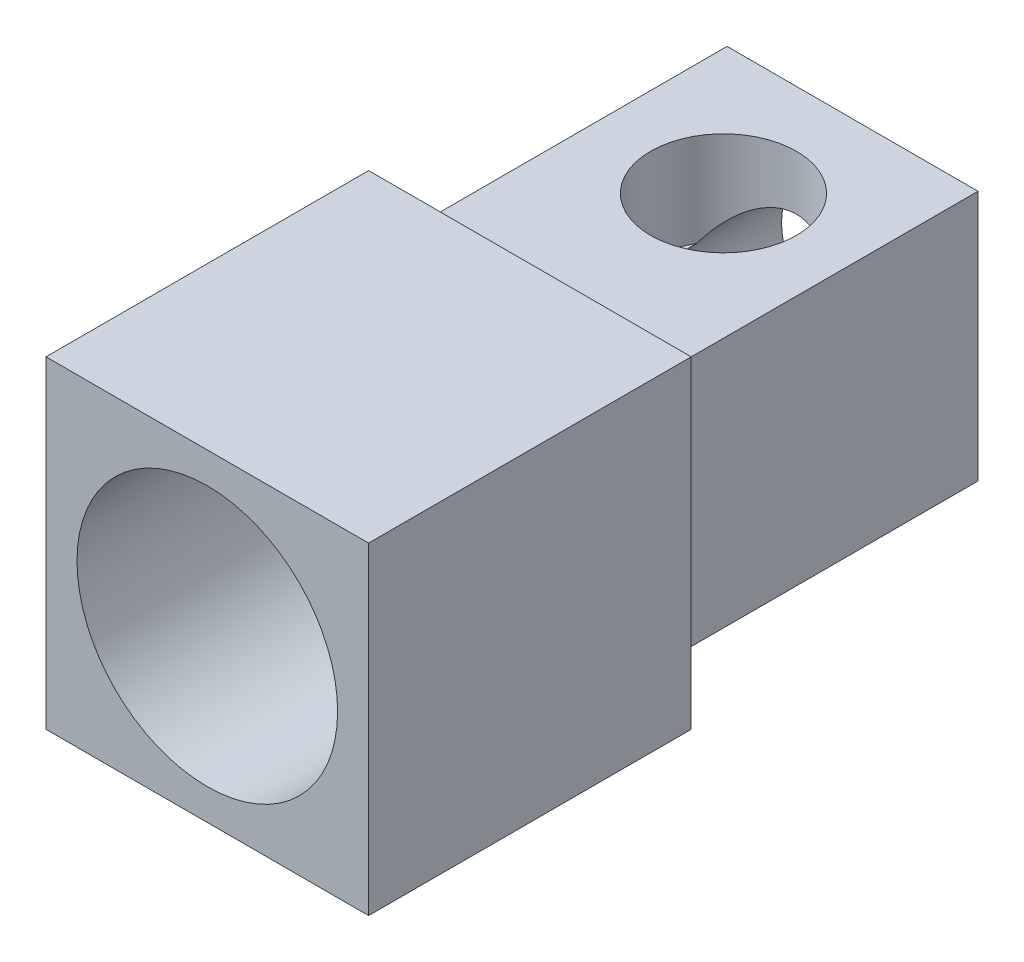
ISO-10303-21;
HEADER;
FILE_DESCRIPTION(('STEP AP214'),'2;1');
FILE_NAME('part.step','',(''),(''),'','','');
FILE_SCHEMA(('AUTOMOTIVE_DESIGN { 1 0 10303 214 1 1 1 1 }'));
ENDSEC;
DATA;
#1=APPLICATION_CONTEXT('core data for automotive mechanical design processes');
#2=APPLICATION_PROTOCOL_DEFINITION('international standard','automotive_design',2000,#1);
#3=PRODUCT_CONTEXT('',#1,'mechanical');
#4=PRODUCT('Part','Part','',(#3));
#5=PRODUCT_RELATED_PRODUCT_CATEGORY('part','',(#4));
#6=PRODUCT_DEFINITION_FORMATION('','',#4);
#7=PRODUCT_DEFINITION_CONTEXT('part definition',#1,'design');
#8=PRODUCT_DEFINITION('design','',#6,#7);
#9=PRODUCT_DEFINITION_SHAPE('','',#8);
#10=(LENGTH_UNIT() NAMED_UNIT(*) SI_UNIT(.MILLI.,.METRE.));
#11=(NAMED_UNIT(*) PLANE_ANGLE_UNIT() SI_UNIT($,.RADIAN.));
#12=(NAMED_UNIT(*) SI_UNIT($,.STERADIAN.) SOLID_ANGLE_UNIT());
#13=UNCERTAINTY_MEASURE_WITH_UNIT(LENGTH_MEASURE(1.E-05),#10,'distance_accuracy_value','');
#14=(GEOMETRIC_REPRESENTATION_CONTEXT(3) GLOBAL_UNCERTAINTY_ASSIGNED_CONTEXT((#13)) GLOBAL_UNIT_ASSIGNED_CONTEXT((#10,
#11,#12)) REPRESENTATION_CONTEXT('',''));
#15=CARTESIAN_POINT('',(0.,0.,0.));
#16=DIRECTION('',(0.,0.,1.));
#17=DIRECTION('',(1.,0.,0.));
#18=AXIS2_PLACEMENT_3D('',#15,#16,#17);
#19=CARTESIAN_POINT('',(0.,0.,0.));
#20=DIRECTION('',(0.,0.,1.));
#21=DIRECTION('',(1.,0.,0.));
#22=AXIS2_PLACEMENT_3D('',#19,#20,#21);
#23=PLANE('',#22);
#24=CARTESIAN_POINT('',(-3.41304347826087,-0.260869565217391,0.));
#25=DIRECTION('',(0.,0.,-1.));
#26=DIRECTION('',(-1.,0.,0.));
#27=AXIS2_PLACEMENT_3D('',#24,#25,#26);
#28=CIRCLE('',#27,1.1);
#29=CARTESIAN_POINT('',(-4.51304347826087,-0.260869565217391,0.));
#30=VERTEX_POINT('',#29);
#31=EDGE_CURVE('E240',#30,#30,#28,.T.);
#32=ORIENTED_EDGE('',*,*,#31,.F.);
#33=EDGE_LOOP('',(#32));
#34=FACE_BOUND('',#33,.T.);
#35=DIRECTION('',(0.,-1.,0.));
#36=VECTOR('',#35,1.);
#37=CARTESIAN_POINT('',(-1.46849982999786,-2.20541321348039,0.));
#38=LINE('',#37,#36);
#39=CARTESIAN_POINT('',(-1.46849982999786,1.68367408304561,0.));
#40=VERTEX_POINT('',#39);
#41=CARTESIAN_POINT('',(-1.46849982999786,-2.20541321348039,0.));
#42=VERTEX_POINT('',#41);
#43=EDGE_CURVE('E141',#40,#42,#38,.T.);
#44=ORIENTED_EDGE('',*,*,#43,.T.);
#45=DIRECTION('',(-1.,0.,0.));
#46=VECTOR('',#45,1.);
#47=CARTESIAN_POINT('',(-1.46849982999786,-2.20541321348039,0.));
#48=LINE('',#47,#46);
#49=CARTESIAN_POINT('',(-5.35758712652388,-2.20541321348039,0.));
#50=VERTEX_POINT('',#49);
#51=EDGE_CURVE('E115',#42,#50,#48,.T.);
#52=ORIENTED_EDGE('',*,*,#51,.T.);
#53=DIRECTION('',(0.,1.,0.));
#54=VECTOR('',#53,1.);
#55=CARTESIAN_POINT('',(-5.35758712652388,-2.20541321348039,0.));
#56=LINE('',#55,#54);
#57=CARTESIAN_POINT('',(-5.35758712652388,1.68367408304561,0.));
#58=VERTEX_POINT('',#57);
#59=EDGE_CURVE('E55',#50,#58,#56,.T.);
#60=ORIENTED_EDGE('',*,*,#59,.T.);
#61=DIRECTION('',(1.,0.,0.));
#62=VECTOR('',#61,1.);
#63=CARTESIAN_POINT('',(-1.46849982999786,1.68367408304561,0.));
#64=LINE('',#63,#62);
#65=EDGE_CURVE('E134',#58,#40,#64,.T.);
#66=ORIENTED_EDGE('',*,*,#65,.T.);
#67=EDGE_LOOP('',(#44,#52,#60,#66));
#68=FACE_BOUND('',#67,.T.);
#69=ADVANCED_FACE('F33',(#34,#68),#23,.F.);
#70=CARTESIAN_POINT('',(-3.41304347826087,0.239130434782609,2.));
#71=DIRECTION('',(0.,1.,0.));
#72=DIRECTION('',(-1.,0.,0.));
#73=AXIS2_PLACEMENT_3D('',#70,#71,#72);
#74=CYLINDRICAL_SURFACE('',#73,1.1303);
#75=CARTESIAN_POINT('',(-3.41304347826087,0.239130434782609,2.));
#76=DIRECTION('',(0.,1.,0.));
#77=DIRECTION('',(-1.,0.,0.));
#78=AXIS2_PLACEMENT_3D('',#75,#76,#77);
#79=CIRCLE('',#78,1.1303);
#80=CARTESIAN_POINT('',(-2.4332475811476,0.239130434782609,2.56354067288884));
#81=VERTEX_POINT('',#80);
#82=CARTESIAN_POINT('',(-2.4332475811476,0.239130434782609,1.43645932711116));
#83=VERTEX_POINT('',#82);
#84=EDGE_CURVE('E159',#81,#83,#79,.T.);
#85=ORIENTED_EDGE('',*,*,#84,.F.);
#86=CARTESIAN_POINT('',(-4.39283937537414,0.239130434782609,2.56354067288883));
#87=CARTESIAN_POINT('',(-4.37629129599731,0.271519858096063,2.59231836773183));
#88=CARTESIAN_POINT('',(-4.35811320989576,0.303207503549897,2.62098294087009));
#89=CARTESIAN_POINT('',(-4.31831036586881,0.365118265753084,2.67769590911217));
#90=CARTESIAN_POINT('',(-4.29667623328289,0.395337098862779,2.70574238513539));
#91=CARTESIAN_POINT('',(-4.24958140363458,0.454424023581486,2.76099733355327));
#92=CARTESIAN_POINT('',(-4.2240775884234,0.483271356855061,2.78819156708674));
#93=CARTESIAN_POINT('',(-4.16933927121493,0.538840857616629,2.84085396298437));
#94=CARTESIAN_POINT('',(-4.14010949331117,0.56556564778696,2.86632424957176));
#95=CARTESIAN_POINT('',(-4.07041150362564,0.622500042646617,2.92078010205513));
#96=CARTESIAN_POINT('',(-4.02891933040392,0.652042433014698,2.94917559370353));
#97=CARTESIAN_POINT('',(-3.94020751224405,0.705968397418197,3.0011506046098));
#98=CARTESIAN_POINT('',(-3.89301350307135,0.73037380185854,3.02475048809601));
#99=CARTESIAN_POINT('',(-3.80132306818623,0.76932682588183,3.06247979976721));
#100=CARTESIAN_POINT('',(-3.75761299571348,0.784828510742617,3.0775218402842));
#101=CARTESIAN_POINT('',(-3.66716599047387,0.810403746001871,3.10235893960548));
#102=CARTESIAN_POINT('',(-3.62042905536271,0.820477292196188,3.11215399434593));
#103=CARTESIAN_POINT('',(-3.5249289770623,0.834493483598695,3.1257866607039));
#104=CARTESIAN_POINT('',(-3.47615691062973,0.838405379738677,3.12959439305675));
#105=CARTESIAN_POINT('',(-3.37845468556489,0.839670560650714,3.13082563557435));
#106=CARTESIAN_POINT('',(-3.32952457659995,0.837025737197622,3.12825098721289));
#107=CARTESIAN_POINT('',(-3.23734962397292,0.825914870606985,3.11744219980031));
#108=CARTESIAN_POINT('',(-3.19397878847868,0.817971419566254,3.10971615850827));
#109=CARTESIAN_POINT('',(-3.10951802059535,0.797319992440406,3.08965009096581));
#110=CARTESIAN_POINT('',(-3.06842875716512,0.784610627365649,3.07730871961518));
#111=CARTESIAN_POINT('',(-2.9768586431031,0.750474264713503,3.0442086695302));
#112=CARTESIAN_POINT('',(-2.92744617062569,0.727564606370088,3.02202520408776));
#113=CARTESIAN_POINT('',(-2.83446272105367,0.676189731020639,2.97242646387556));
#114=CARTESIAN_POINT('',(-2.79090420645091,0.64771296873239,2.94500031929871));
#115=CARTESIAN_POINT('',(-2.69537956071242,0.57561383266525,2.87586688294728));
#116=CARTESIAN_POINT('',(-2.64593689888158,0.530207778772215,2.83255048938973));
#117=CARTESIAN_POINT('',(-2.5576969566589,0.433867999141433,2.74160270979468));
#118=CARTESIAN_POINT('',(-2.51890315650036,0.382932473847678,2.69396991983264));
#119=CARTESIAN_POINT('',(-2.4756872739934,0.315037750231637,2.631833598722));
#120=CARTESIAN_POINT('',(-2.46665572358188,0.300070850149582,2.61821512803579));
#121=CARTESIAN_POINT('',(-2.44937724473266,0.269837291073555,2.59091932593116));
#122=CARTESIAN_POINT('',(-2.44112807944188,0.254571647050481,2.57724228682185));
#123=CARTESIAN_POINT('',(-2.43324758114718,0.239130434782859,2.56354067288886));
#124=B_SPLINE_CURVE_WITH_KNOTS('',3,(#86,#87,#88,#89,#90,#91,#92,#93,#94,#95,#96,#97,#98,#99,
#100,#101,#102,#103,#104,#105,#106,#107,#108,#109,#110,#111,#112,#113,#114,#115,#116,#117,#118,
#119,#120,#121,#122,#123),.UNSPECIFIED.,.F.,.F.,(4,2,2,2,2,2,2,2,2,2,2,2,2,2,2,2,2,2,4),(0.,
0.139136476056646,0.27865698207966,0.419865017666792,0.560895766002821,0.735227786573159,
0.908803291850601,1.05446999570251,1.20013681237464,1.34652828660974,1.49287752822034,
1.62658463797202,1.76033074597472,1.93579543150089,2.11162793852052,2.3500268537622,
2.58850358940566,2.65497303724273,2.7212463261039),.UNSPECIFIED.);
#125=CARTESIAN_POINT('',(-4.39283937537414,0.239130434782609,2.56354067288883));
#126=VERTEX_POINT('',#125);
#127=EDGE_CURVE('E160',#126,#81,#124,.T.);
#128=ORIENTED_EDGE('',*,*,#127,.F.);
#129=CARTESIAN_POINT('',(-4.39283937537414,0.239130434782609,1.43645932711117));
#130=VERTEX_POINT('',#129);
#131=EDGE_CURVE('E157',#130,#126,#79,.T.);
#132=ORIENTED_EDGE('',*,*,#131,.F.);
#133=CARTESIAN_POINT('',(-2.4332475811476,0.239130434782609,1.43645932711116));
#134=CARTESIAN_POINT('',(-2.44979566052442,0.271519858096063,1.40768163226817));
#135=CARTESIAN_POINT('',(-2.46797374662598,0.303207503549897,1.37901705912991));
#136=CARTESIAN_POINT('',(-2.50777659065292,0.365118265753084,1.32230409088782));
#137=CARTESIAN_POINT('',(-2.52941072323885,0.395337098862779,1.29425761486461));
#138=CARTESIAN_POINT('',(-2.57650555288716,0.454424023581486,1.23900266644673));
#139=CARTESIAN_POINT('',(-2.60200936809834,0.483271356855062,1.21180843291326));
#140=CARTESIAN_POINT('',(-2.65674768530681,0.53884085761663,1.15914603701562));
#141=CARTESIAN_POINT('',(-2.68597746321057,0.56556564778696,1.13367575042823));
#142=CARTESIAN_POINT('',(-2.7556754528961,0.622500042646618,1.07921989794487));
#143=CARTESIAN_POINT('',(-2.79716762611782,0.652042433014699,1.05082440629647));
#144=CARTESIAN_POINT('',(-2.88587944427769,0.705968397418198,0.9988493953902));
#145=CARTESIAN_POINT('',(-2.93307345345039,0.73037380185854,0.975249511903983));
#146=CARTESIAN_POINT('',(-3.02476388833551,0.769326825881831,0.937520200232784));
#147=CARTESIAN_POINT('',(-3.06847396080826,0.784828510742618,0.922478159715799));
#148=CARTESIAN_POINT('',(-3.15892096604786,0.810403746001871,0.897641060394519));
#149=CARTESIAN_POINT('',(-3.20565790115903,0.820477292196188,0.88784600565407));
#150=CARTESIAN_POINT('',(-3.30115797945944,0.834493483598694,0.874213339296104));
#151=CARTESIAN_POINT('',(-3.34993004589201,0.838405379738677,0.870405606943247));
#152=CARTESIAN_POINT('',(-3.44763227095685,0.839670560650714,0.869174364425654));
#153=CARTESIAN_POINT('',(-3.49656237992179,0.837025737197621,0.871749012787106));
#154=CARTESIAN_POINT('',(-3.58873733254882,0.825914870606984,0.882557800199691));
#155=CARTESIAN_POINT('',(-3.63210816804306,0.817971419566253,0.890283841491731));
#156=CARTESIAN_POINT('',(-3.71656893592639,0.797319992440405,0.910349909034186));
#157=CARTESIAN_POINT('',(-3.75765819935662,0.784610627365649,0.922691280384824));
#158=CARTESIAN_POINT('',(-3.84922831341864,0.750474264713502,0.955791330469802));
#159=CARTESIAN_POINT('',(-3.89864078589605,0.727564606370087,0.977974795912237));
#160=CARTESIAN_POINT('',(-3.99162423546807,0.676189731020639,1.02757353612444));
#161=CARTESIAN_POINT('',(-4.03518275007083,0.64771296873239,1.05499968070129));
#162=CARTESIAN_POINT('',(-4.13070739580932,0.57561383266525,1.12413311705272));
#163=CARTESIAN_POINT('',(-4.18015005764016,0.530207778772215,1.16744951061027));
#164=CARTESIAN_POINT('',(-4.26838999986284,0.433867999141432,1.25839729020532));
#165=CARTESIAN_POINT('',(-4.30718380002138,0.382932473847677,1.30603008016737));
#166=CARTESIAN_POINT('',(-4.35039968252834,0.315037750231637,1.368166401278));
#167=CARTESIAN_POINT('',(-4.35943123293986,0.300070850149581,1.38178487196421));
#168=CARTESIAN_POINT('',(-4.37670971178908,0.269837291073554,1.40908067406884));
#169=CARTESIAN_POINT('',(-4.38495887707986,0.25457164705048,1.42275771317815));
#170=CARTESIAN_POINT('',(-4.39283937537456,0.239130434782859,1.43645932711115));
#171=B_SPLINE_CURVE_WITH_KNOTS('',3,(#133,#134,#135,#136,#137,#138,#139,#140,#141,#142,#143,
#144,#145,#146,#147,#148,#149,#150,#151,#152,#153,#154,#155,#156,#157,#158,#159,#160,#161,#162,
#163,#164,#165,#166,#167,#168,#169,#170),.UNSPECIFIED.,.F.,.F.,(4,2,2,2,2,2,2,2,2,2,2,2,2,2,2,2,
2,2,4),(0.,0.139136476056646,0.27865698207966,0.419865017666792,0.560895766002822,
0.73522778657316,0.908803291850601,1.05446999570251,1.20013681237464,1.34652828660974,
1.49287752822034,1.62658463797202,1.76033074597472,1.93579543150089,2.11162793852052,
2.3500268537622,2.58850358940566,2.65497303724274,2.7212463261039),.UNSPECIFIED.);
#172=EDGE_CURVE('E168',#83,#130,#171,.T.);
#173=ORIENTED_EDGE('',*,*,#172,.F.);
#174=EDGE_LOOP('',(#85,#128,#132,#173));
#175=FACE_BOUND('',#174,.T.);
#176=CARTESIAN_POINT('',(-3.41304347826087,1.68367408304561,2.));
#177=DIRECTION('',(0.,1.,0.));
#178=DIRECTION('',(-1.,0.,0.));
#179=AXIS2_PLACEMENT_3D('',#176,#177,#178);
#180=CIRCLE('',#179,1.1303);
#181=CARTESIAN_POINT('',(-4.54334347826087,1.68367408304561,2.));
#182=VERTEX_POINT('',#181);
#183=EDGE_CURVE('E146',#182,#182,#180,.F.);
#184=ORIENTED_EDGE('',*,*,#183,.F.);
#185=EDGE_LOOP('',(#184));
#186=FACE_BOUND('',#185,.T.);
#187=ADVANCED_FACE('F177',(#175,#186),#74,.F.);
#188=CARTESIAN_POINT('',(-3.41304347826087,-0.260869565217391,10.));
#189=DIRECTION('',(0.,0.,-1.));
#190=DIRECTION('',(-1.,0.,0.));
#191=AXIS2_PLACEMENT_3D('',#188,#189,#190);
#192=CYLINDRICAL_SURFACE('',#191,1.1);
#193=CARTESIAN_POINT('',(-3.41304347826087,-0.260869565217391,6.));
#194=DIRECTION('',(0.,0.,1.));
#195=DIRECTION('',(1.,0.,0.));
#196=AXIS2_PLACEMENT_3D('',#193,#194,#195);
#197=CIRCLE('',#196,1.1);
#198=CARTESIAN_POINT('',(-2.31304347826087,-0.260869565217391,6.));
#199=VERTEX_POINT('',#198);
#200=EDGE_CURVE('E238',#199,#199,#197,.F.);
#201=ORIENTED_EDGE('',*,*,#200,.F.);
#202=EDGE_LOOP('',(#201));
#203=FACE_BOUND('',#202,.T.);
#204=ORIENTED_EDGE('',*,*,#31,.T.);
#205=EDGE_LOOP('',(#204));
#206=FACE_BOUND('',#205,.T.);
#207=DIRECTION('',(0.,0.,-1.));
#208=VECTOR('',#207,1.);
#209=CARTESIAN_POINT('',(-2.4332475811476,0.239130434782609,10.));
#210=LINE('',#209,#208);
#211=EDGE_CURVE('E41',#83,#81,#210,.F.);
#212=ORIENTED_EDGE('',*,*,#211,.F.);
#213=ORIENTED_EDGE('',*,*,#172,.T.);
#214=DIRECTION('',(0.,0.,-1.));
#215=VECTOR('',#214,1.);
#216=CARTESIAN_POINT('',(-4.39283937537414,0.239130434782609,10.));
#217=LINE('',#216,#215);
#218=EDGE_CURVE('E230',#126,#130,#217,.T.);
#219=ORIENTED_EDGE('',*,*,#218,.F.);
#220=ORIENTED_EDGE('',*,*,#127,.T.);
#221=EDGE_LOOP('',(#212,#213,#219,#220));
#222=FACE_BOUND('',#221,.T.);
#223=ADVANCED_FACE('F173',(#203,#206,#222),#192,.F.);
#224=CARTESIAN_POINT('',(-5.91304347826087,2.23913043478261,10.));
#225=DIRECTION('',(1.,0.,0.));
#226=DIRECTION('',(0.,0.,-1.));
#227=AXIS2_PLACEMENT_3D('',#224,#225,#226);
#228=PLANE('',#227);
#229=DIRECTION('',(0.,0.,-1.));
#230=VECTOR('',#229,1.);
#231=CARTESIAN_POINT('',(-5.91304347826087,2.23913043478261,10.));
#232=LINE('',#231,#230);
#233=CARTESIAN_POINT('',(-5.91304347826087,2.23913043478261,10.));
#234=VERTEX_POINT('',#233);
#235=CARTESIAN_POINT('',(-5.91304347826087,2.23913043478261,5.));
#236=VERTEX_POINT('',#235);
#237=EDGE_CURVE('E376',#234,#236,#232,.T.);
#238=ORIENTED_EDGE('',*,*,#237,.T.);
#239=DIRECTION('',(0.,-1.,0.));
#240=VECTOR('',#239,1.);
#241=CARTESIAN_POINT('',(-5.91304347826087,2.23913043478261,5.));
#242=LINE('',#241,#240);
#243=CARTESIAN_POINT('',(-5.91304347826087,-2.76086956521739,5.));
#244=VERTEX_POINT('',#243);
#245=EDGE_CURVE('E48',#236,#244,#242,.T.);
#246=ORIENTED_EDGE('',*,*,#245,.T.);
#247=DIRECTION('',(0.,0.,-1.));
#248=VECTOR('',#247,1.);
#249=CARTESIAN_POINT('',(-5.91304347826087,-2.76086956521739,10.));
#250=LINE('',#249,#248);
#251=CARTESIAN_POINT('',(-5.91304347826087,-2.76086956521739,10.));
#252=VERTEX_POINT('',#251);
#253=EDGE_CURVE('E224',#252,#244,#250,.T.);
#254=ORIENTED_EDGE('',*,*,#253,.F.);
#255=DIRECTION('',(0.,-1.,0.));
#256=VECTOR('',#255,1.);
#257=CARTESIAN_POINT('',(-5.91304347826087,2.23913043478261,10.));
#258=LINE('',#257,#256);
#259=EDGE_CURVE('E362',#234,#252,#258,.T.);
#260=ORIENTED_EDGE('',*,*,#259,.F.);
#261=EDGE_LOOP('',(#238,#246,#254,#260));
#262=FACE_BOUND('',#261,.T.);
#263=ADVANCED_FACE('F35',(#262),#228,.F.);
#264=CARTESIAN_POINT('',(-5.91304347826087,-2.76086956521739,10.));
#265=DIRECTION('',(0.,1.,0.));
#266=DIRECTION('',(0.,0.,1.));
#267=AXIS2_PLACEMENT_3D('',#264,#265,#266);
#268=PLANE('',#267);
#269=ORIENTED_EDGE('',*,*,#253,.T.);
#270=DIRECTION('',(1.,0.,0.));
#271=VECTOR('',#270,1.);
#272=CARTESIAN_POINT('',(-5.91304347826087,-2.76086956521739,5.));
#273=LINE('',#272,#271);
#274=CARTESIAN_POINT('',(-0.913043478260869,-2.76086956521739,5.));
#275=VERTEX_POINT('',#274);
#276=EDGE_CURVE('E153',#244,#275,#273,.T.);
#277=ORIENTED_EDGE('',*,*,#276,.T.);
#278=DIRECTION('',(0.,0.,-1.));
#279=VECTOR('',#278,1.);
#280=CARTESIAN_POINT('',(-0.913043478260869,-2.76086956521739,10.));
#281=LINE('',#280,#279);
#282=CARTESIAN_POINT('',(-0.913043478260869,-2.76086956521739,10.));
#283=VERTEX_POINT('',#282);
#284=EDGE_CURVE('E231',#283,#275,#281,.T.);
#285=ORIENTED_EDGE('',*,*,#284,.F.);
#286=DIRECTION('',(1.,0.,0.));
#287=VECTOR('',#286,1.);
#288=CARTESIAN_POINT('',(-5.91304347826087,-2.76086956521739,10.));
#289=LINE('',#288,#287);
#290=EDGE_CURVE('E227',#252,#283,#289,.T.);
#291=ORIENTED_EDGE('',*,*,#290,.F.);
#292=EDGE_LOOP('',(#269,#277,#285,#291));
#293=FACE_BOUND('',#292,.T.);
#294=ADVANCED_FACE('F214',(#293),#268,.F.);
#295=CARTESIAN_POINT('',(-0.913043478260869,2.23913043478261,10.));
#296=DIRECTION('',(-1.,0.,0.));
#297=DIRECTION('',(0.,0.,1.));
#298=AXIS2_PLACEMENT_3D('',#295,#296,#297);
#299=PLANE('',#298);
#300=ORIENTED_EDGE('',*,*,#284,.T.);
#301=DIRECTION('',(0.,1.,0.));
#302=VECTOR('',#301,1.);
#303=CARTESIAN_POINT('',(-0.913043478260869,2.23913043478261,5.));
#304=LINE('',#303,#302);
#305=CARTESIAN_POINT('',(-0.913043478260868,2.23913043478261,5.));
#306=VERTEX_POINT('',#305);
#307=EDGE_CURVE('E150',#275,#306,#304,.T.);
#308=ORIENTED_EDGE('',*,*,#307,.T.);
#309=DIRECTION('',(0.,0.,-1.));
#310=VECTOR('',#309,1.);
#311=CARTESIAN_POINT('',(-0.913043478260869,2.23913043478261,10.));
#312=LINE('',#311,#310);
#313=CARTESIAN_POINT('',(-0.913043478260869,2.23913043478261,10.));
#314=VERTEX_POINT('',#313);
#315=EDGE_CURVE('E234',#314,#306,#312,.T.);
#316=ORIENTED_EDGE('',*,*,#315,.F.);
#317=DIRECTION('',(0.,1.,0.));
#318=VECTOR('',#317,1.);
#319=CARTESIAN_POINT('',(-0.913043478260869,2.23913043478261,10.));
#320=LINE('',#319,#318);
#321=EDGE_CURVE('E368',#283,#314,#320,.T.);
#322=ORIENTED_EDGE('',*,*,#321,.F.);
#323=EDGE_LOOP('',(#300,#308,#316,#322));
#324=FACE_BOUND('',#323,.T.);
#325=ADVANCED_FACE('F211',(#324),#299,.F.);
#326=CARTESIAN_POINT('',(-5.91304347826087,2.23913043478261,10.));
#327=DIRECTION('',(0.,-1.,0.));
#328=DIRECTION('',(1.,0.,0.));
#329=AXIS2_PLACEMENT_3D('',#326,#327,#328);
#330=PLANE('',#329);
#331=ORIENTED_EDGE('',*,*,#315,.T.);
#332=DIRECTION('',(-1.,0.,0.));
#333=VECTOR('',#332,1.);
#334=CARTESIAN_POINT('',(-5.91304347826087,2.23913043478261,5.));
#335=LINE('',#334,#333);
#336=EDGE_CURVE('E11',#306,#236,#335,.T.);
#337=ORIENTED_EDGE('',*,*,#336,.T.);
#338=ORIENTED_EDGE('',*,*,#237,.F.);
#339=DIRECTION('',(-1.,0.,0.));
#340=VECTOR('',#339,1.);
#341=CARTESIAN_POINT('',(-5.91304347826087,2.23913043478261,10.));
#342=LINE('',#341,#340);
#343=EDGE_CURVE('E364',#314,#234,#342,.T.);
#344=ORIENTED_EDGE('',*,*,#343,.F.);
#345=EDGE_LOOP('',(#331,#337,#338,#344));
#346=FACE_BOUND('',#345,.T.);
#347=ADVANCED_FACE('F208',(#346),#330,.F.);
#348=CARTESIAN_POINT('',(0.,0.,10.));
#349=DIRECTION('',(0.,0.,1.));
#350=DIRECTION('',(1.,0.,0.));
#351=AXIS2_PLACEMENT_3D('',#348,#349,#350);
#352=PLANE('',#351);
#353=CARTESIAN_POINT('',(-3.41304347826087,-0.260869565217391,10.));
#354=DIRECTION('',(0.,0.,1.));
#355=DIRECTION('',(1.,0.,0.));
#356=AXIS2_PLACEMENT_3D('',#353,#354,#355);
#357=CIRCLE('',#356,2.0193);
#358=CARTESIAN_POINT('',(-1.39374347826087,-0.260869565217391,10.));
#359=VERTEX_POINT('',#358);
#360=EDGE_CURVE('E361',#359,#359,#357,.T.);
#361=ORIENTED_EDGE('',*,*,#360,.F.);
#362=EDGE_LOOP('',(#361));
#363=FACE_BOUND('',#362,.T.);
#364=ORIENTED_EDGE('',*,*,#259,.T.);
#365=ORIENTED_EDGE('',*,*,#290,.T.);
#366=ORIENTED_EDGE('',*,*,#321,.T.);
#367=ORIENTED_EDGE('',*,*,#343,.T.);
#368=EDGE_LOOP('',(#364,#365,#366,#367));
#369=FACE_BOUND('',#368,.T.);
#370=ADVANCED_FACE('F189',(#363,#369),#352,.T.);
#371=CARTESIAN_POINT('',(-3.41304347826087,-0.260869565217391,6.));
#372=DIRECTION('',(0.,0.,1.));
#373=DIRECTION('',(1.,0.,0.));
#374=AXIS2_PLACEMENT_3D('',#371,#372,#373);
#375=PLANE('',#374);
#376=CARTESIAN_POINT('',(-3.41304347826087,-0.260869565217391,6.));
#377=DIRECTION('',(0.,0.,1.));
#378=DIRECTION('',(1.,0.,0.));
#379=AXIS2_PLACEMENT_3D('',#376,#377,#378);
#380=CIRCLE('',#379,2.0193);
#381=CARTESIAN_POINT('',(-1.39374347826087,-0.260869565217391,6.));
#382=VERTEX_POINT('',#381);
#383=EDGE_CURVE('E241',#382,#382,#380,.T.);
#384=ORIENTED_EDGE('',*,*,#383,.T.);
#385=EDGE_LOOP('',(#384));
#386=FACE_BOUND('',#385,.T.);
#387=ORIENTED_EDGE('',*,*,#200,.T.);
#388=EDGE_LOOP('',(#387));
#389=FACE_BOUND('',#388,.T.);
#390=ADVANCED_FACE('F185',(#386,#389),#375,.T.);
#391=CARTESIAN_POINT('',(-3.41304347826087,-0.260869565217391,6.));
#392=DIRECTION('',(0.,0.,1.));
#393=DIRECTION('',(1.,0.,0.));
#394=AXIS2_PLACEMENT_3D('',#391,#392,#393);
#395=CYLINDRICAL_SURFACE('',#394,2.0193);
#396=ORIENTED_EDGE('',*,*,#383,.F.);
#397=EDGE_LOOP('',(#396));
#398=FACE_BOUND('',#397,.T.);
#399=ORIENTED_EDGE('',*,*,#360,.T.);
#400=EDGE_LOOP('',(#399));
#401=FACE_BOUND('',#400,.T.);
#402=ADVANCED_FACE('F188',(#398,#401),#395,.F.);
#403=CARTESIAN_POINT('',(-3.41304347826087,0.239130434782609,2.));
#404=DIRECTION('',(0.,1.,0.));
#405=DIRECTION('',(-1.,0.,0.));
#406=AXIS2_PLACEMENT_3D('',#403,#404,#405);
#407=PLANE('',#406);
#408=ORIENTED_EDGE('',*,*,#211,.T.);
#409=ORIENTED_EDGE('',*,*,#84,.T.);
#410=EDGE_LOOP('',(#408,#409));
#411=FACE_BOUND('',#410,.T.);
#412=ADVANCED_FACE('F183',(#411),#407,.T.);
#413=ORIENTED_EDGE('',*,*,#218,.T.);
#414=ORIENTED_EDGE('',*,*,#131,.T.);
#415=EDGE_LOOP('',(#413,#414));
#416=FACE_BOUND('',#415,.T.);
#417=ADVANCED_FACE('F196',(#416),#407,.T.);
#418=CARTESIAN_POINT('',(0.,0.,5.));
#419=DIRECTION('',(0.,0.,1.));
#420=DIRECTION('',(1.,0.,0.));
#421=AXIS2_PLACEMENT_3D('',#418,#419,#420);
#422=PLANE('',#421);
#423=DIRECTION('',(0.,-1.,0.));
#424=VECTOR('',#423,1.);
#425=CARTESIAN_POINT('',(-1.46849982999786,-2.20541321348039,5.));
#426=LINE('',#425,#424);
#427=CARTESIAN_POINT('',(-1.46849982999786,1.68367408304561,5.));
#428=VERTEX_POINT('',#427);
#429=CARTESIAN_POINT('',(-1.46849982999786,-2.20541321348039,5.));
#430=VERTEX_POINT('',#429);
#431=EDGE_CURVE('E127',#428,#430,#426,.T.);
#432=ORIENTED_EDGE('',*,*,#431,.F.);
#433=DIRECTION('',(1.,0.,0.));
#434=VECTOR('',#433,1.);
#435=CARTESIAN_POINT('',(-1.46849982999786,1.68367408304561,5.));
#436=LINE('',#435,#434);
#437=CARTESIAN_POINT('',(-5.35758712652388,1.68367408304561,5.));
#438=VERTEX_POINT('',#437);
#439=EDGE_CURVE('E121',#438,#428,#436,.T.);
#440=ORIENTED_EDGE('',*,*,#439,.F.);
#441=DIRECTION('',(0.,1.,0.));
#442=VECTOR('',#441,1.);
#443=CARTESIAN_POINT('',(-5.35758712652388,-2.20541321348039,5.));
#444=LINE('',#443,#442);
#445=CARTESIAN_POINT('',(-5.35758712652388,-2.20541321348039,5.));
#446=VERTEX_POINT('',#445);
#447=EDGE_CURVE('E130',#446,#438,#444,.T.);
#448=ORIENTED_EDGE('',*,*,#447,.F.);
#449=DIRECTION('',(-1.,0.,0.));
#450=VECTOR('',#449,1.);
#451=CARTESIAN_POINT('',(-1.46849982999786,-2.20541321348039,5.));
#452=LINE('',#451,#450);
#453=EDGE_CURVE('E113',#430,#446,#452,.T.);
#454=ORIENTED_EDGE('',*,*,#453,.F.);
#455=EDGE_LOOP('',(#432,#440,#448,#454));
#456=FACE_BOUND('',#455,.T.);
#457=ORIENTED_EDGE('',*,*,#336,.F.);
#458=ORIENTED_EDGE('',*,*,#307,.F.);
#459=ORIENTED_EDGE('',*,*,#276,.F.);
#460=ORIENTED_EDGE('',*,*,#245,.F.);
#461=EDGE_LOOP('',(#457,#458,#459,#460));
#462=FACE_BOUND('',#461,.T.);
#463=ADVANCED_FACE('F125',(#456,#462),#422,.F.);
#464=CARTESIAN_POINT('',(-1.46849982999786,1.68367408304561,5.));
#465=DIRECTION('',(0.,1.,0.));
#466=DIRECTION('',(-1.,0.,0.));
#467=AXIS2_PLACEMENT_3D('',#464,#465,#466);
#468=PLANE('',#467);
#469=ORIENTED_EDGE('',*,*,#65,.F.);
#470=DIRECTION('',(0.,0.,-1.));
#471=VECTOR('',#470,1.);
#472=CARTESIAN_POINT('',(-5.35758712652388,1.68367408304561,5.));
#473=LINE('',#472,#471);
#474=EDGE_CURVE('E147',#438,#58,#473,.T.);
#475=ORIENTED_EDGE('',*,*,#474,.F.);
#476=ORIENTED_EDGE('',*,*,#439,.T.);
#477=DIRECTION('',(0.,0.,-1.));
#478=VECTOR('',#477,1.);
#479=CARTESIAN_POINT('',(-1.46849982999786,1.68367408304561,5.));
#480=LINE('',#479,#478);
#481=EDGE_CURVE('E133',#428,#40,#480,.T.);
#482=ORIENTED_EDGE('',*,*,#481,.T.);
#483=EDGE_LOOP('',(#469,#475,#476,#482));
#484=FACE_BOUND('',#483,.T.);
#485=ORIENTED_EDGE('',*,*,#183,.T.);
#486=EDGE_LOOP('',(#485));
#487=FACE_BOUND('',#486,.T.);
#488=ADVANCED_FACE('F246',(#484,#487),#468,.T.);
#489=CARTESIAN_POINT('',(-1.46849982999786,-2.20541321348039,5.));
#490=DIRECTION('',(1.,0.,0.));
#491=DIRECTION('',(0.,1.,0.));
#492=AXIS2_PLACEMENT_3D('',#489,#490,#491);
#493=PLANE('',#492);
#494=ORIENTED_EDGE('',*,*,#43,.F.);
#495=ORIENTED_EDGE('',*,*,#481,.F.);
#496=ORIENTED_EDGE('',*,*,#431,.T.);
#497=DIRECTION('',(0.,0.,-1.));
#498=VECTOR('',#497,1.);
#499=CARTESIAN_POINT('',(-1.46849982999786,-2.20541321348039,5.));
#500=LINE('',#499,#498);
#501=EDGE_CURVE('E110',#430,#42,#500,.T.);
#502=ORIENTED_EDGE('',*,*,#501,.T.);
#503=EDGE_LOOP('',(#494,#495,#496,#502));
#504=FACE_BOUND('',#503,.T.);
#505=ADVANCED_FACE('F132',(#504),#493,.T.);
#506=CARTESIAN_POINT('',(-5.35758712652388,-2.20541321348039,5.));
#507=DIRECTION('',(-1.,0.,0.));
#508=DIRECTION('',(0.,0.,1.));
#509=AXIS2_PLACEMENT_3D('',#506,#507,#508);
#510=PLANE('',#509);
#511=ORIENTED_EDGE('',*,*,#59,.F.);
#512=DIRECTION('',(0.,0.,-1.));
#513=VECTOR('',#512,1.);
#514=CARTESIAN_POINT('',(-5.35758712652388,-2.20541321348039,5.));
#515=LINE('',#514,#513);
#516=EDGE_CURVE('E120',#446,#50,#515,.T.);
#517=ORIENTED_EDGE('',*,*,#516,.F.);
#518=ORIENTED_EDGE('',*,*,#447,.T.);
#519=ORIENTED_EDGE('',*,*,#474,.T.);
#520=EDGE_LOOP('',(#511,#517,#518,#519));
#521=FACE_BOUND('',#520,.T.);
#522=ADVANCED_FACE('F255',(#521),#510,.T.);
#523=CARTESIAN_POINT('',(-1.46849982999786,-2.20541321348039,5.));
#524=DIRECTION('',(0.,-1.,0.));
#525=DIRECTION('',(0.,0.,-1.));
#526=AXIS2_PLACEMENT_3D('',#523,#524,#525);
#527=PLANE('',#526);
#528=ORIENTED_EDGE('',*,*,#51,.F.);
#529=ORIENTED_EDGE('',*,*,#501,.F.);
#530=ORIENTED_EDGE('',*,*,#453,.T.);
#531=ORIENTED_EDGE('',*,*,#516,.T.);
#532=EDGE_LOOP('',(#528,#529,#530,#531));
#533=FACE_BOUND('',#532,.T.);
#534=ADVANCED_FACE('F112',(#533),#527,.T.);
#535=CLOSED_SHELL('',(#69,#187,#223,#263,#294,#325,#347,#370,#390,#402,#412,#417,#463,#488,#505,
#522,#534));
#536=MANIFOLD_SOLID_BREP('B2',#535);
#537=ADVANCED_BREP_SHAPE_REPRESENTATION('',(#18,#536),#14);
#538=SHAPE_DEFINITION_REPRESENTATION(#9,#537);
ENDSEC;
END-ISO-10303-21;
